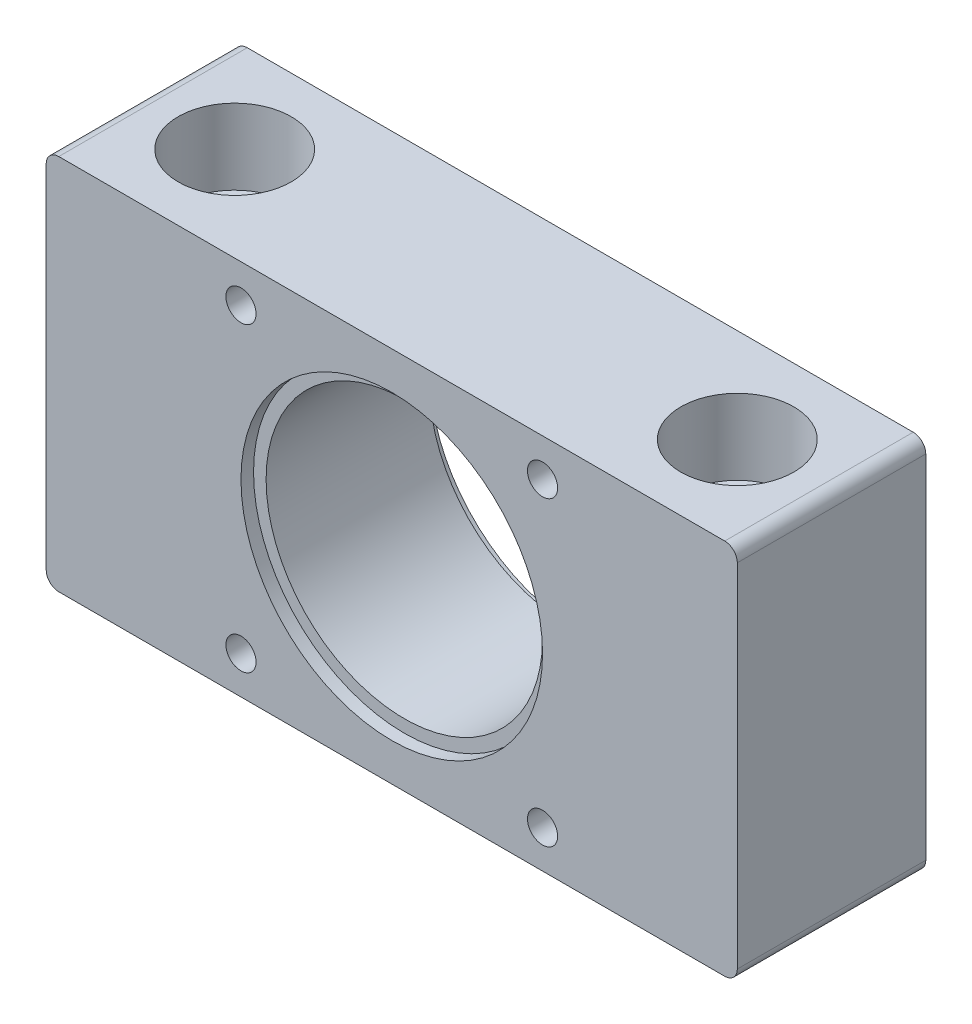
ISO-10303-21;
HEADER;
FILE_DESCRIPTION(('STEP AP214'),'2;1');
FILE_NAME('part.step','',(''),(''),'','','');
FILE_SCHEMA(('AUTOMOTIVE_DESIGN { 1 0 10303 214 1 1 1 1 }'));
ENDSEC;
DATA;
#1=APPLICATION_CONTEXT('core data for automotive mechanical design processes');
#2=APPLICATION_PROTOCOL_DEFINITION('international standard','automotive_design',2000,#1);
#3=PRODUCT_CONTEXT('',#1,'mechanical');
#4=PRODUCT('Part','Part','',(#3));
#5=PRODUCT_RELATED_PRODUCT_CATEGORY('part','',(#4));
#6=PRODUCT_DEFINITION_FORMATION('','',#4);
#7=PRODUCT_DEFINITION_CONTEXT('part definition',#1,'design');
#8=PRODUCT_DEFINITION('design','',#6,#7);
#9=PRODUCT_DEFINITION_SHAPE('','',#8);
#10=(LENGTH_UNIT() NAMED_UNIT(*) SI_UNIT(.MILLI.,.METRE.));
#11=(NAMED_UNIT(*) PLANE_ANGLE_UNIT() SI_UNIT($,.RADIAN.));
#12=(NAMED_UNIT(*) SI_UNIT($,.STERADIAN.) SOLID_ANGLE_UNIT());
#13=UNCERTAINTY_MEASURE_WITH_UNIT(LENGTH_MEASURE(1.E-05),#10,'distance_accuracy_value','');
#14=(GEOMETRIC_REPRESENTATION_CONTEXT(3) GLOBAL_UNCERTAINTY_ASSIGNED_CONTEXT((#13)) GLOBAL_UNIT_ASSIGNED_CONTEXT((#10,
#11,#12)) REPRESENTATION_CONTEXT('',''));
#15=CARTESIAN_POINT('',(0.,0.,0.));
#16=DIRECTION('',(0.,0.,1.));
#17=DIRECTION('',(1.,0.,0.));
#18=AXIS2_PLACEMENT_3D('',#15,#16,#17);
#19=CARTESIAN_POINT('',(20.,-15.,7.49999999999999));
#20=DIRECTION('',(0.,1.,0.));
#21=DIRECTION('',(0.,0.,1.));
#22=AXIS2_PLACEMENT_3D('',#19,#20,#21);
#23=CYLINDRICAL_SURFACE('',#22,2.55);
#24=CARTESIAN_POINT('',(20.,-15.,7.49999999999999));
#25=DIRECTION('',(0.,1.,0.));
#26=DIRECTION('',(0.,0.,-1.));
#27=AXIS2_PLACEMENT_3D('',#24,#25,#26);
#28=CIRCLE('',#27,2.55);
#29=CARTESIAN_POINT('',(20.,-15.,4.94999999999999));
#30=VERTEX_POINT('',#29);
#31=EDGE_CURVE('E149',#30,#30,#28,.T.);
#32=ORIENTED_EDGE('',*,*,#31,.F.);
#33=EDGE_LOOP('',(#32));
#34=FACE_BOUND('',#33,.T.);
#35=CARTESIAN_POINT('',(20.,9.,7.49999999999999));
#36=DIRECTION('',(0.,1.,0.));
#37=DIRECTION('',(0.,0.,1.));
#38=AXIS2_PLACEMENT_3D('',#35,#36,#37);
#39=CIRCLE('',#38,2.55);
#40=CARTESIAN_POINT('',(20.,9.,10.05));
#41=VERTEX_POINT('',#40);
#42=EDGE_CURVE('E51',#41,#41,#39,.F.);
#43=ORIENTED_EDGE('',*,*,#42,.F.);
#44=EDGE_LOOP('',(#43));
#45=FACE_BOUND('',#44,.T.);
#46=ADVANCED_FACE('F47',(#34,#45),#23,.F.);
#47=CARTESIAN_POINT('',(-20.,-15.,7.5));
#48=DIRECTION('',(0.,1.,0.));
#49=DIRECTION('',(0.,0.,1.));
#50=AXIS2_PLACEMENT_3D('',#47,#48,#49);
#51=CYLINDRICAL_SURFACE('',#50,2.55);
#52=CARTESIAN_POINT('',(-20.,-15.,7.5));
#53=DIRECTION('',(0.,1.,0.));
#54=DIRECTION('',(0.,0.,1.));
#55=AXIS2_PLACEMENT_3D('',#52,#53,#54);
#56=CIRCLE('',#55,2.55);
#57=CARTESIAN_POINT('',(-20.,-15.,10.05));
#58=VERTEX_POINT('',#57);
#59=EDGE_CURVE('E143',#58,#58,#56,.T.);
#60=ORIENTED_EDGE('',*,*,#59,.F.);
#61=EDGE_LOOP('',(#60));
#62=FACE_BOUND('',#61,.T.);
#63=CARTESIAN_POINT('',(-20.,9.,7.5));
#64=DIRECTION('',(0.,1.,0.));
#65=DIRECTION('',(0.,0.,1.));
#66=AXIS2_PLACEMENT_3D('',#63,#64,#65);
#67=CIRCLE('',#66,2.55);
#68=CARTESIAN_POINT('',(-20.,9.,10.05));
#69=VERTEX_POINT('',#68);
#70=EDGE_CURVE('E186',#69,#69,#67,.F.);
#71=ORIENTED_EDGE('',*,*,#70,.F.);
#72=EDGE_LOOP('',(#71));
#73=FACE_BOUND('',#72,.T.);
#74=ADVANCED_FACE('F273',(#62,#73),#51,.F.);
#75=CARTESIAN_POINT('',(0.,0.,15.));
#76=DIRECTION('',(0.,0.,-1.));
#77=DIRECTION('',(-1.,0.,0.));
#78=AXIS2_PLACEMENT_3D('',#75,#76,#77);
#79=CYLINDRICAL_SURFACE('',#78,11.);
#80=CARTESIAN_POINT('',(0.,0.,1.));
#81=DIRECTION('',(0.,0.,-1.));
#82=DIRECTION('',(-1.,0.,0.));
#83=AXIS2_PLACEMENT_3D('',#80,#81,#82);
#84=CIRCLE('',#83,11.);
#85=CARTESIAN_POINT('',(-11.,0.,1.));
#86=VERTEX_POINT('',#85);
#87=EDGE_CURVE('E158',#86,#86,#84,.T.);
#88=ORIENTED_EDGE('',*,*,#87,.T.);
#89=EDGE_LOOP('',(#88));
#90=FACE_BOUND('',#89,.T.);
#91=CARTESIAN_POINT('',(0.,0.,14.));
#92=DIRECTION('',(0.,0.,1.));
#93=DIRECTION('',(1.,0.,0.));
#94=AXIS2_PLACEMENT_3D('',#91,#92,#93);
#95=CIRCLE('',#94,11.);
#96=CARTESIAN_POINT('',(11.,0.,14.));
#97=VERTEX_POINT('',#96);
#98=EDGE_CURVE('E162',#97,#97,#95,.T.);
#99=ORIENTED_EDGE('',*,*,#98,.T.);
#100=EDGE_LOOP('',(#99));
#101=FACE_BOUND('',#100,.T.);
#102=ADVANCED_FACE('F279',(#90,#101),#79,.F.);
#103=CARTESIAN_POINT('',(0.,0.,15.));
#104=DIRECTION('',(0.,0.,1.));
#105=DIRECTION('',(1.,0.,0.));
#106=AXIS2_PLACEMENT_3D('',#103,#104,#105);
#107=PLANE('',#106);
#108=CARTESIAN_POINT('',(12.,12.,15.));
#109=DIRECTION('',(0.,0.,1.));
#110=DIRECTION('',(1.,0.,0.));
#111=AXIS2_PLACEMENT_3D('',#108,#109,#110);
#112=CIRCLE('',#111,1.2);
#113=CARTESIAN_POINT('',(13.2,12.,15.));
#114=VERTEX_POINT('',#113);
#115=EDGE_CURVE('E217',#114,#114,#112,.T.);
#116=ORIENTED_EDGE('',*,*,#115,.F.);
#117=EDGE_LOOP('',(#116));
#118=FACE_BOUND('',#117,.T.);
#119=CARTESIAN_POINT('',(-12.,-12.,15.));
#120=DIRECTION('',(0.,0.,1.));
#121=DIRECTION('',(1.,0.,0.));
#122=AXIS2_PLACEMENT_3D('',#119,#120,#121);
#123=CIRCLE('',#122,1.2);
#124=CARTESIAN_POINT('',(-10.8,-12.,15.));
#125=VERTEX_POINT('',#124);
#126=EDGE_CURVE('E210',#125,#125,#123,.T.);
#127=ORIENTED_EDGE('',*,*,#126,.F.);
#128=EDGE_LOOP('',(#127));
#129=FACE_BOUND('',#128,.T.);
#130=CARTESIAN_POINT('',(12.,-12.,15.));
#131=DIRECTION('',(0.,0.,1.));
#132=DIRECTION('',(-1.,0.,0.));
#133=AXIS2_PLACEMENT_3D('',#130,#131,#132);
#134=CIRCLE('',#133,1.2);
#135=CARTESIAN_POINT('',(10.8,-12.,15.));
#136=VERTEX_POINT('',#135);
#137=EDGE_CURVE('E192',#136,#136,#134,.T.);
#138=ORIENTED_EDGE('',*,*,#137,.F.);
#139=EDGE_LOOP('',(#138));
#140=FACE_BOUND('',#139,.T.);
#141=CARTESIAN_POINT('',(-12.,12.,15.));
#142=DIRECTION('',(0.,0.,1.));
#143=DIRECTION('',(-1.,0.,0.));
#144=AXIS2_PLACEMENT_3D('',#141,#142,#143);
#145=CIRCLE('',#144,1.2);
#146=CARTESIAN_POINT('',(-13.2,12.,15.));
#147=VERTEX_POINT('',#146);
#148=EDGE_CURVE('E216',#147,#147,#145,.T.);
#149=ORIENTED_EDGE('',*,*,#148,.F.);
#150=EDGE_LOOP('',(#149));
#151=FACE_BOUND('',#150,.T.);
#152=CARTESIAN_POINT('',(0.,0.,15.));
#153=DIRECTION('',(0.,0.,1.));
#154=DIRECTION('',(1.,0.,0.));
#155=AXIS2_PLACEMENT_3D('',#152,#153,#154);
#156=CIRCLE('',#155,12.);
#157=CARTESIAN_POINT('',(12.,0.,15.));
#158=VERTEX_POINT('',#157);
#159=EDGE_CURVE('E228',#158,#158,#156,.T.);
#160=ORIENTED_EDGE('',*,*,#159,.F.);
#161=EDGE_LOOP('',(#160));
#162=FACE_BOUND('',#161,.T.);
#163=DIRECTION('',(-1.,0.,0.));
#164=VECTOR('',#163,1.);
#165=CARTESIAN_POINT('',(-27.5,15.,15.));
#166=LINE('',#165,#164);
#167=CARTESIAN_POINT('',(26.5,15.,15.));
#168=VERTEX_POINT('',#167);
#169=CARTESIAN_POINT('',(-26.5,15.,15.));
#170=VERTEX_POINT('',#169);
#171=EDGE_CURVE('E152',#168,#170,#166,.T.);
#172=ORIENTED_EDGE('',*,*,#171,.T.);
#173=CARTESIAN_POINT('',(-26.5,14.,15.));
#174=DIRECTION('',(0.,0.,1.));
#175=DIRECTION('',(1.,0.,0.));
#176=AXIS2_PLACEMENT_3D('',#173,#174,#175);
#177=CIRCLE('',#176,1.);
#178=CARTESIAN_POINT('',(-27.5,14.,15.));
#179=VERTEX_POINT('',#178);
#180=EDGE_CURVE('E179',#170,#179,#177,.T.);
#181=ORIENTED_EDGE('',*,*,#180,.T.);
#182=DIRECTION('',(0.,-1.,0.));
#183=VECTOR('',#182,1.);
#184=CARTESIAN_POINT('',(-27.5,15.,15.));
#185=LINE('',#184,#183);
#186=CARTESIAN_POINT('',(-27.5,-14.,15.));
#187=VERTEX_POINT('',#186);
#188=EDGE_CURVE('E135',#179,#187,#185,.T.);
#189=ORIENTED_EDGE('',*,*,#188,.T.);
#190=CARTESIAN_POINT('',(-26.5,-14.,15.));
#191=DIRECTION('',(0.,0.,1.));
#192=DIRECTION('',(1.,0.,0.));
#193=AXIS2_PLACEMENT_3D('',#190,#191,#192);
#194=CIRCLE('',#193,1.);
#195=CARTESIAN_POINT('',(-26.5,-15.,15.));
#196=VERTEX_POINT('',#195);
#197=EDGE_CURVE('E176',#187,#196,#194,.T.);
#198=ORIENTED_EDGE('',*,*,#197,.T.);
#199=DIRECTION('',(1.,0.,0.));
#200=VECTOR('',#199,1.);
#201=CARTESIAN_POINT('',(-27.5,-15.,15.));
#202=LINE('',#201,#200);
#203=CARTESIAN_POINT('',(26.5,-15.,15.));
#204=VERTEX_POINT('',#203);
#205=EDGE_CURVE('E242',#196,#204,#202,.T.);
#206=ORIENTED_EDGE('',*,*,#205,.T.);
#207=CARTESIAN_POINT('',(26.5,-14.,15.));
#208=DIRECTION('',(0.,0.,1.));
#209=DIRECTION('',(1.,0.,0.));
#210=AXIS2_PLACEMENT_3D('',#207,#208,#209);
#211=CIRCLE('',#210,1.);
#212=CARTESIAN_POINT('',(27.5,-14.,15.));
#213=VERTEX_POINT('',#212);
#214=EDGE_CURVE('E71',#204,#213,#211,.T.);
#215=ORIENTED_EDGE('',*,*,#214,.T.);
#216=DIRECTION('',(0.,1.,0.));
#217=VECTOR('',#216,1.);
#218=CARTESIAN_POINT('',(27.5,15.,15.));
#219=LINE('',#218,#217);
#220=CARTESIAN_POINT('',(27.5,14.,15.));
#221=VERTEX_POINT('',#220);
#222=EDGE_CURVE('E243',#213,#221,#219,.T.);
#223=ORIENTED_EDGE('',*,*,#222,.T.);
#224=CARTESIAN_POINT('',(26.5,14.,15.));
#225=DIRECTION('',(0.,0.,1.));
#226=DIRECTION('',(1.,0.,0.));
#227=AXIS2_PLACEMENT_3D('',#224,#225,#226);
#228=CIRCLE('',#227,1.);
#229=EDGE_CURVE('E174',#221,#168,#228,.T.);
#230=ORIENTED_EDGE('',*,*,#229,.T.);
#231=EDGE_LOOP('',(#172,#181,#189,#198,#206,#215,#223,#230));
#232=FACE_BOUND('',#231,.T.);
#233=ADVANCED_FACE('F247',(#118,#129,#140,#151,#162,#232),#107,.T.);
#234=CARTESIAN_POINT('',(0.,0.,0.));
#235=DIRECTION('',(0.,0.,1.));
#236=DIRECTION('',(1.,0.,0.));
#237=AXIS2_PLACEMENT_3D('',#234,#235,#236);
#238=PLANE('',#237);
#239=CARTESIAN_POINT('',(12.,12.,0.));
#240=DIRECTION('',(0.,0.,1.));
#241=DIRECTION('',(1.,0.,0.));
#242=AXIS2_PLACEMENT_3D('',#239,#240,#241);
#243=CIRCLE('',#242,1.2);
#244=CARTESIAN_POINT('',(13.2,12.,0.));
#245=VERTEX_POINT('',#244);
#246=EDGE_CURVE('E213',#245,#245,#243,.T.);
#247=ORIENTED_EDGE('',*,*,#246,.T.);
#248=EDGE_LOOP('',(#247));
#249=FACE_BOUND('',#248,.T.);
#250=CARTESIAN_POINT('',(-12.,-12.,0.));
#251=DIRECTION('',(0.,0.,1.));
#252=DIRECTION('',(1.,0.,0.));
#253=AXIS2_PLACEMENT_3D('',#250,#251,#252);
#254=CIRCLE('',#253,1.2);
#255=CARTESIAN_POINT('',(-10.8,-12.,0.));
#256=VERTEX_POINT('',#255);
#257=EDGE_CURVE('E220',#256,#256,#254,.T.);
#258=ORIENTED_EDGE('',*,*,#257,.T.);
#259=EDGE_LOOP('',(#258));
#260=FACE_BOUND('',#259,.T.);
#261=CARTESIAN_POINT('',(12.,-12.,0.));
#262=DIRECTION('',(0.,0.,1.));
#263=DIRECTION('',(-1.,0.,0.));
#264=AXIS2_PLACEMENT_3D('',#261,#262,#263);
#265=CIRCLE('',#264,1.2);
#266=CARTESIAN_POINT('',(10.8,-12.,0.));
#267=VERTEX_POINT('',#266);
#268=EDGE_CURVE('E207',#267,#267,#265,.T.);
#269=ORIENTED_EDGE('',*,*,#268,.T.);
#270=EDGE_LOOP('',(#269));
#271=FACE_BOUND('',#270,.T.);
#272=CARTESIAN_POINT('',(-12.,12.,0.));
#273=DIRECTION('',(0.,0.,1.));
#274=DIRECTION('',(-1.,0.,0.));
#275=AXIS2_PLACEMENT_3D('',#272,#273,#274);
#276=CIRCLE('',#275,1.2);
#277=CARTESIAN_POINT('',(-13.2,12.,0.));
#278=VERTEX_POINT('',#277);
#279=EDGE_CURVE('E225',#278,#278,#276,.T.);
#280=ORIENTED_EDGE('',*,*,#279,.T.);
#281=EDGE_LOOP('',(#280));
#282=FACE_BOUND('',#281,.T.);
#283=CARTESIAN_POINT('',(0.,0.,0.));
#284=DIRECTION('',(0.,0.,-1.));
#285=DIRECTION('',(-1.,0.,0.));
#286=AXIS2_PLACEMENT_3D('',#283,#284,#285);
#287=CIRCLE('',#286,12.);
#288=CARTESIAN_POINT('',(-12.,0.,0.));
#289=VERTEX_POINT('',#288);
#290=EDGE_CURVE('E165',#289,#289,#287,.T.);
#291=ORIENTED_EDGE('',*,*,#290,.F.);
#292=EDGE_LOOP('',(#291));
#293=FACE_BOUND('',#292,.T.);
#294=DIRECTION('',(0.,-1.,0.));
#295=VECTOR('',#294,1.);
#296=CARTESIAN_POINT('',(-27.5,15.,0.));
#297=LINE('',#296,#295);
#298=CARTESIAN_POINT('',(-27.5,14.,0.));
#299=VERTEX_POINT('',#298);
#300=CARTESIAN_POINT('',(-27.5,-14.,0.));
#301=VERTEX_POINT('',#300);
#302=EDGE_CURVE('E132',#299,#301,#297,.T.);
#303=ORIENTED_EDGE('',*,*,#302,.F.);
#304=CARTESIAN_POINT('',(-26.5,14.,0.));
#305=DIRECTION('',(0.,0.,1.));
#306=DIRECTION('',(1.,0.,0.));
#307=AXIS2_PLACEMENT_3D('',#304,#305,#306);
#308=CIRCLE('',#307,1.);
#309=CARTESIAN_POINT('',(-26.5,15.,0.));
#310=VERTEX_POINT('',#309);
#311=EDGE_CURVE('E115',#299,#310,#308,.F.);
#312=ORIENTED_EDGE('',*,*,#311,.T.);
#313=DIRECTION('',(-1.,0.,0.));
#314=VECTOR('',#313,1.);
#315=CARTESIAN_POINT('',(-27.5,15.,0.));
#316=LINE('',#315,#314);
#317=CARTESIAN_POINT('',(26.5,15.,0.));
#318=VERTEX_POINT('',#317);
#319=EDGE_CURVE('E156',#318,#310,#316,.T.);
#320=ORIENTED_EDGE('',*,*,#319,.F.);
#321=CARTESIAN_POINT('',(26.5,14.,0.));
#322=DIRECTION('',(0.,0.,1.));
#323=DIRECTION('',(1.,0.,0.));
#324=AXIS2_PLACEMENT_3D('',#321,#322,#323);
#325=CIRCLE('',#324,1.);
#326=CARTESIAN_POINT('',(27.5,14.,0.));
#327=VERTEX_POINT('',#326);
#328=EDGE_CURVE('E136',#318,#327,#325,.F.);
#329=ORIENTED_EDGE('',*,*,#328,.T.);
#330=DIRECTION('',(0.,1.,0.));
#331=VECTOR('',#330,1.);
#332=CARTESIAN_POINT('',(27.5,15.,0.));
#333=LINE('',#332,#331);
#334=CARTESIAN_POINT('',(27.5,-14.,0.));
#335=VERTEX_POINT('',#334);
#336=EDGE_CURVE('E146',#335,#327,#333,.T.);
#337=ORIENTED_EDGE('',*,*,#336,.F.);
#338=CARTESIAN_POINT('',(26.5,-14.,0.));
#339=DIRECTION('',(0.,0.,1.));
#340=DIRECTION('',(1.,0.,0.));
#341=AXIS2_PLACEMENT_3D('',#338,#339,#340);
#342=CIRCLE('',#341,1.);
#343=CARTESIAN_POINT('',(26.5,-15.,0.));
#344=VERTEX_POINT('',#343);
#345=EDGE_CURVE('E126',#335,#344,#342,.F.);
#346=ORIENTED_EDGE('',*,*,#345,.T.);
#347=DIRECTION('',(1.,0.,0.));
#348=VECTOR('',#347,1.);
#349=CARTESIAN_POINT('',(-27.5,-15.,0.));
#350=LINE('',#349,#348);
#351=CARTESIAN_POINT('',(-26.5,-15.,0.));
#352=VERTEX_POINT('',#351);
#353=EDGE_CURVE('E142',#352,#344,#350,.T.);
#354=ORIENTED_EDGE('',*,*,#353,.F.);
#355=CARTESIAN_POINT('',(-26.5,-14.,0.));
#356=DIRECTION('',(0.,0.,1.));
#357=DIRECTION('',(1.,0.,0.));
#358=AXIS2_PLACEMENT_3D('',#355,#356,#357);
#359=CIRCLE('',#358,1.);
#360=EDGE_CURVE('E141',#352,#301,#359,.F.);
#361=ORIENTED_EDGE('',*,*,#360,.T.);
#362=EDGE_LOOP('',(#303,#312,#320,#329,#337,#346,#354,#361));
#363=FACE_BOUND('',#362,.T.);
#364=ADVANCED_FACE('F139',(#249,#260,#271,#282,#293,#363),#238,.F.);
#365=CARTESIAN_POINT('',(-27.5,15.,15.));
#366=DIRECTION('',(1.,0.,0.));
#367=DIRECTION('',(0.,0.,-1.));
#368=AXIS2_PLACEMENT_3D('',#365,#366,#367);
#369=PLANE('',#368);
#370=ORIENTED_EDGE('',*,*,#188,.F.);
#371=DIRECTION('',(0.,0.,-1.));
#372=VECTOR('',#371,1.);
#373=CARTESIAN_POINT('',(-27.5,14.,15.));
#374=LINE('',#373,#372);
#375=EDGE_CURVE('E119',#179,#299,#374,.T.);
#376=ORIENTED_EDGE('',*,*,#375,.T.);
#377=ORIENTED_EDGE('',*,*,#302,.T.);
#378=DIRECTION('',(0.,0.,-1.));
#379=VECTOR('',#378,1.);
#380=CARTESIAN_POINT('',(-27.5,-14.,15.));
#381=LINE('',#380,#379);
#382=EDGE_CURVE('E137',#301,#187,#381,.F.);
#383=ORIENTED_EDGE('',*,*,#382,.T.);
#384=EDGE_LOOP('',(#370,#376,#377,#383));
#385=FACE_BOUND('',#384,.T.);
#386=ADVANCED_FACE('F131',(#385),#369,.F.);
#387=CARTESIAN_POINT('',(-27.5,-15.,15.));
#388=DIRECTION('',(0.,1.,0.));
#389=DIRECTION('',(0.,0.,1.));
#390=AXIS2_PLACEMENT_3D('',#387,#388,#389);
#391=PLANE('',#390);
#392=ORIENTED_EDGE('',*,*,#59,.T.);
#393=EDGE_LOOP('',(#392));
#394=FACE_BOUND('',#393,.T.);
#395=ORIENTED_EDGE('',*,*,#31,.T.);
#396=EDGE_LOOP('',(#395));
#397=FACE_BOUND('',#396,.T.);
#398=ORIENTED_EDGE('',*,*,#353,.T.);
#399=DIRECTION('',(0.,0.,-1.));
#400=VECTOR('',#399,1.);
#401=CARTESIAN_POINT('',(26.5,-15.,15.));
#402=LINE('',#401,#400);
#403=EDGE_CURVE('E11',#344,#204,#402,.F.);
#404=ORIENTED_EDGE('',*,*,#403,.T.);
#405=ORIENTED_EDGE('',*,*,#205,.F.);
#406=DIRECTION('',(0.,0.,-1.));
#407=VECTOR('',#406,1.);
#408=CARTESIAN_POINT('',(-26.5,-15.,15.));
#409=LINE('',#408,#407);
#410=EDGE_CURVE('E56',#196,#352,#409,.T.);
#411=ORIENTED_EDGE('',*,*,#410,.T.);
#412=EDGE_LOOP('',(#398,#404,#405,#411));
#413=FACE_BOUND('',#412,.T.);
#414=ADVANCED_FACE('F259',(#394,#397,#413),#391,.F.);
#415=CARTESIAN_POINT('',(27.5,15.,15.));
#416=DIRECTION('',(-1.,0.,0.));
#417=DIRECTION('',(0.,0.,1.));
#418=AXIS2_PLACEMENT_3D('',#415,#416,#417);
#419=PLANE('',#418);
#420=ORIENTED_EDGE('',*,*,#222,.F.);
#421=DIRECTION('',(0.,0.,-1.));
#422=VECTOR('',#421,1.);
#423=CARTESIAN_POINT('',(27.5,-14.,15.));
#424=LINE('',#423,#422);
#425=EDGE_CURVE('E182',#213,#335,#424,.T.);
#426=ORIENTED_EDGE('',*,*,#425,.T.);
#427=ORIENTED_EDGE('',*,*,#336,.T.);
#428=DIRECTION('',(0.,0.,-1.));
#429=VECTOR('',#428,1.);
#430=CARTESIAN_POINT('',(27.5,14.,15.));
#431=LINE('',#430,#429);
#432=EDGE_CURVE('E64',#327,#221,#431,.F.);
#433=ORIENTED_EDGE('',*,*,#432,.T.);
#434=EDGE_LOOP('',(#420,#426,#427,#433));
#435=FACE_BOUND('',#434,.T.);
#436=ADVANCED_FACE('F253',(#435),#419,.F.);
#437=CARTESIAN_POINT('',(-27.5,15.,15.));
#438=DIRECTION('',(0.,-1.,0.));
#439=DIRECTION('',(0.,0.,-1.));
#440=AXIS2_PLACEMENT_3D('',#437,#438,#439);
#441=PLANE('',#440);
#442=CARTESIAN_POINT('',(-20.,15.,7.5));
#443=DIRECTION('',(0.,1.,0.));
#444=DIRECTION('',(0.,0.,1.));
#445=AXIS2_PLACEMENT_3D('',#442,#443,#444);
#446=CIRCLE('',#445,4.5);
#447=CARTESIAN_POINT('',(-20.,15.,12.));
#448=VERTEX_POINT('',#447);
#449=EDGE_CURVE('E194',#448,#448,#446,.T.);
#450=ORIENTED_EDGE('',*,*,#449,.F.);
#451=EDGE_LOOP('',(#450));
#452=FACE_BOUND('',#451,.T.);
#453=CARTESIAN_POINT('',(20.,15.,7.49999999999999));
#454=DIRECTION('',(0.,1.,0.));
#455=DIRECTION('',(0.,0.,1.));
#456=AXIS2_PLACEMENT_3D('',#453,#454,#455);
#457=CIRCLE('',#456,4.5);
#458=CARTESIAN_POINT('',(20.,15.,12.));
#459=VERTEX_POINT('',#458);
#460=EDGE_CURVE('E204',#459,#459,#457,.T.);
#461=ORIENTED_EDGE('',*,*,#460,.F.);
#462=EDGE_LOOP('',(#461));
#463=FACE_BOUND('',#462,.T.);
#464=ORIENTED_EDGE('',*,*,#319,.T.);
#465=DIRECTION('',(0.,0.,-1.));
#466=VECTOR('',#465,1.);
#467=CARTESIAN_POINT('',(-26.5,15.,15.));
#468=LINE('',#467,#466);
#469=EDGE_CURVE('E120',#310,#170,#468,.F.);
#470=ORIENTED_EDGE('',*,*,#469,.T.);
#471=ORIENTED_EDGE('',*,*,#171,.F.);
#472=DIRECTION('',(0.,0.,-1.));
#473=VECTOR('',#472,1.);
#474=CARTESIAN_POINT('',(26.5,15.,15.));
#475=LINE('',#474,#473);
#476=EDGE_CURVE('E125',#168,#318,#475,.T.);
#477=ORIENTED_EDGE('',*,*,#476,.T.);
#478=EDGE_LOOP('',(#464,#470,#471,#477));
#479=FACE_BOUND('',#478,.T.);
#480=ADVANCED_FACE('F250',(#452,#463,#479),#441,.F.);
#481=CARTESIAN_POINT('',(0.,0.,1.));
#482=DIRECTION('',(0.,0.,-1.));
#483=DIRECTION('',(-1.,0.,0.));
#484=AXIS2_PLACEMENT_3D('',#481,#482,#483);
#485=CYLINDRICAL_SURFACE('',#484,12.);
#486=CARTESIAN_POINT('',(0.,0.,1.));
#487=DIRECTION('',(0.,0.,-1.));
#488=DIRECTION('',(-1.,0.,0.));
#489=AXIS2_PLACEMENT_3D('',#486,#487,#488);
#490=CIRCLE('',#489,12.);
#491=CARTESIAN_POINT('',(-12.,0.,1.));
#492=VERTEX_POINT('',#491);
#493=EDGE_CURVE('E161',#492,#492,#490,.T.);
#494=ORIENTED_EDGE('',*,*,#493,.F.);
#495=EDGE_LOOP('',(#494));
#496=FACE_BOUND('',#495,.T.);
#497=ORIENTED_EDGE('',*,*,#290,.T.);
#498=EDGE_LOOP('',(#497));
#499=FACE_BOUND('',#498,.T.);
#500=ADVANCED_FACE('F297',(#496,#499),#485,.F.);
#501=CARTESIAN_POINT('',(0.,0.,1.));
#502=DIRECTION('',(0.,0.,-1.));
#503=DIRECTION('',(-1.,0.,0.));
#504=AXIS2_PLACEMENT_3D('',#501,#502,#503);
#505=PLANE('',#504);
#506=ORIENTED_EDGE('',*,*,#87,.F.);
#507=EDGE_LOOP('',(#506));
#508=FACE_BOUND('',#507,.T.);
#509=ORIENTED_EDGE('',*,*,#493,.T.);
#510=EDGE_LOOP('',(#509));
#511=FACE_BOUND('',#510,.T.);
#512=ADVANCED_FACE('F336',(#508,#511),#505,.T.);
#513=CARTESIAN_POINT('',(0.,0.,14.));
#514=DIRECTION('',(0.,0.,1.));
#515=DIRECTION('',(1.,0.,0.));
#516=AXIS2_PLACEMENT_3D('',#513,#514,#515);
#517=CYLINDRICAL_SURFACE('',#516,12.);
#518=CARTESIAN_POINT('',(0.,0.,14.));
#519=DIRECTION('',(0.,0.,1.));
#520=DIRECTION('',(1.,0.,0.));
#521=AXIS2_PLACEMENT_3D('',#518,#519,#520);
#522=CIRCLE('',#521,12.);
#523=CARTESIAN_POINT('',(12.,0.,14.));
#524=VERTEX_POINT('',#523);
#525=EDGE_CURVE('E166',#524,#524,#522,.T.);
#526=ORIENTED_EDGE('',*,*,#525,.F.);
#527=EDGE_LOOP('',(#526));
#528=FACE_BOUND('',#527,.T.);
#529=ORIENTED_EDGE('',*,*,#159,.T.);
#530=EDGE_LOOP('',(#529));
#531=FACE_BOUND('',#530,.T.);
#532=ADVANCED_FACE('F332',(#528,#531),#517,.F.);
#533=CARTESIAN_POINT('',(0.,0.,14.));
#534=DIRECTION('',(0.,0.,1.));
#535=DIRECTION('',(1.,0.,0.));
#536=AXIS2_PLACEMENT_3D('',#533,#534,#535);
#537=PLANE('',#536);
#538=ORIENTED_EDGE('',*,*,#98,.F.);
#539=EDGE_LOOP('',(#538));
#540=FACE_BOUND('',#539,.T.);
#541=ORIENTED_EDGE('',*,*,#525,.T.);
#542=EDGE_LOOP('',(#541));
#543=FACE_BOUND('',#542,.T.);
#544=ADVANCED_FACE('F328',(#540,#543),#537,.T.);
#545=CARTESIAN_POINT('',(-12.,12.,0.));
#546=DIRECTION('',(0.,0.,1.));
#547=DIRECTION('',(1.,0.,0.));
#548=AXIS2_PLACEMENT_3D('',#545,#546,#547);
#549=CYLINDRICAL_SURFACE('',#548,1.2);
#550=ORIENTED_EDGE('',*,*,#279,.F.);
#551=EDGE_LOOP('',(#550));
#552=FACE_BOUND('',#551,.T.);
#553=ORIENTED_EDGE('',*,*,#148,.T.);
#554=EDGE_LOOP('',(#553));
#555=FACE_BOUND('',#554,.T.);
#556=ADVANCED_FACE('F325',(#552,#555),#549,.F.);
#557=CARTESIAN_POINT('',(12.,-12.,0.));
#558=DIRECTION('',(0.,0.,1.));
#559=DIRECTION('',(1.,0.,0.));
#560=AXIS2_PLACEMENT_3D('',#557,#558,#559);
#561=CYLINDRICAL_SURFACE('',#560,1.2);
#562=ORIENTED_EDGE('',*,*,#268,.F.);
#563=EDGE_LOOP('',(#562));
#564=FACE_BOUND('',#563,.T.);
#565=ORIENTED_EDGE('',*,*,#137,.T.);
#566=EDGE_LOOP('',(#565));
#567=FACE_BOUND('',#566,.T.);
#568=ADVANCED_FACE('F317',(#564,#567),#561,.F.);
#569=CARTESIAN_POINT('',(-12.,-12.,0.));
#570=DIRECTION('',(0.,0.,1.));
#571=DIRECTION('',(1.,0.,0.));
#572=AXIS2_PLACEMENT_3D('',#569,#570,#571);
#573=CYLINDRICAL_SURFACE('',#572,1.2);
#574=ORIENTED_EDGE('',*,*,#257,.F.);
#575=EDGE_LOOP('',(#574));
#576=FACE_BOUND('',#575,.T.);
#577=ORIENTED_EDGE('',*,*,#126,.T.);
#578=EDGE_LOOP('',(#577));
#579=FACE_BOUND('',#578,.T.);
#580=ADVANCED_FACE('F311',(#576,#579),#573,.F.);
#581=CARTESIAN_POINT('',(12.,12.,0.));
#582=DIRECTION('',(0.,0.,1.));
#583=DIRECTION('',(1.,0.,0.));
#584=AXIS2_PLACEMENT_3D('',#581,#582,#583);
#585=CYLINDRICAL_SURFACE('',#584,1.2);
#586=ORIENTED_EDGE('',*,*,#246,.F.);
#587=EDGE_LOOP('',(#586));
#588=FACE_BOUND('',#587,.T.);
#589=ORIENTED_EDGE('',*,*,#115,.T.);
#590=EDGE_LOOP('',(#589));
#591=FACE_BOUND('',#590,.T.);
#592=ADVANCED_FACE('F307',(#588,#591),#585,.F.);
#593=CARTESIAN_POINT('',(-26.5,14.,15.));
#594=DIRECTION('',(0.,0.,-1.));
#595=DIRECTION('',(-1.,0.,0.));
#596=AXIS2_PLACEMENT_3D('',#593,#594,#595);
#597=CYLINDRICAL_SURFACE('',#596,1.);
#598=ORIENTED_EDGE('',*,*,#180,.F.);
#599=ORIENTED_EDGE('',*,*,#469,.F.);
#600=ORIENTED_EDGE('',*,*,#311,.F.);
#601=ORIENTED_EDGE('',*,*,#375,.F.);
#602=EDGE_LOOP('',(#598,#599,#600,#601));
#603=FACE_BOUND('',#602,.T.);
#604=ADVANCED_FACE('F118',(#603),#597,.T.);
#605=CARTESIAN_POINT('',(26.5,-14.,15.));
#606=DIRECTION('',(0.,0.,-1.));
#607=DIRECTION('',(-1.,0.,0.));
#608=AXIS2_PLACEMENT_3D('',#605,#606,#607);
#609=CYLINDRICAL_SURFACE('',#608,1.);
#610=ORIENTED_EDGE('',*,*,#214,.F.);
#611=ORIENTED_EDGE('',*,*,#403,.F.);
#612=ORIENTED_EDGE('',*,*,#345,.F.);
#613=ORIENTED_EDGE('',*,*,#425,.F.);
#614=EDGE_LOOP('',(#610,#611,#612,#613));
#615=FACE_BOUND('',#614,.T.);
#616=ADVANCED_FACE('F256',(#615),#609,.T.);
#617=CARTESIAN_POINT('',(-26.5,-14.,15.));
#618=DIRECTION('',(0.,0.,-1.));
#619=DIRECTION('',(-1.,0.,0.));
#620=AXIS2_PLACEMENT_3D('',#617,#618,#619);
#621=CYLINDRICAL_SURFACE('',#620,1.);
#622=ORIENTED_EDGE('',*,*,#197,.F.);
#623=ORIENTED_EDGE('',*,*,#382,.F.);
#624=ORIENTED_EDGE('',*,*,#360,.F.);
#625=ORIENTED_EDGE('',*,*,#410,.F.);
#626=EDGE_LOOP('',(#622,#623,#624,#625));
#627=FACE_BOUND('',#626,.T.);
#628=ADVANCED_FACE('F264',(#627),#621,.T.);
#629=CARTESIAN_POINT('',(26.5,14.,15.));
#630=DIRECTION('',(0.,0.,-1.));
#631=DIRECTION('',(-1.,0.,0.));
#632=AXIS2_PLACEMENT_3D('',#629,#630,#631);
#633=CYLINDRICAL_SURFACE('',#632,1.);
#634=ORIENTED_EDGE('',*,*,#229,.F.);
#635=ORIENTED_EDGE('',*,*,#432,.F.);
#636=ORIENTED_EDGE('',*,*,#328,.F.);
#637=ORIENTED_EDGE('',*,*,#476,.F.);
#638=EDGE_LOOP('',(#634,#635,#636,#637));
#639=FACE_BOUND('',#638,.T.);
#640=ADVANCED_FACE('F49',(#639),#633,.T.);
#641=CARTESIAN_POINT('',(-20.,9.,7.5));
#642=DIRECTION('',(0.,1.,0.));
#643=DIRECTION('',(0.,0.,1.));
#644=AXIS2_PLACEMENT_3D('',#641,#642,#643);
#645=PLANE('',#644);
#646=CARTESIAN_POINT('',(-20.,9.,7.5));
#647=DIRECTION('',(0.,1.,0.));
#648=DIRECTION('',(0.,0.,1.));
#649=AXIS2_PLACEMENT_3D('',#646,#647,#648);
#650=CIRCLE('',#649,4.5);
#651=CARTESIAN_POINT('',(-20.,9.,12.));
#652=VERTEX_POINT('',#651);
#653=EDGE_CURVE('E188',#652,#652,#650,.T.);
#654=ORIENTED_EDGE('',*,*,#653,.T.);
#655=EDGE_LOOP('',(#654));
#656=FACE_BOUND('',#655,.T.);
#657=ORIENTED_EDGE('',*,*,#70,.T.);
#658=EDGE_LOOP('',(#657));
#659=FACE_BOUND('',#658,.T.);
#660=ADVANCED_FACE('F270',(#656,#659),#645,.T.);
#661=CARTESIAN_POINT('',(-20.,9.,7.5));
#662=DIRECTION('',(0.,1.,0.));
#663=DIRECTION('',(0.,0.,1.));
#664=AXIS2_PLACEMENT_3D('',#661,#662,#663);
#665=CYLINDRICAL_SURFACE('',#664,4.5);
#666=ORIENTED_EDGE('',*,*,#653,.F.);
#667=EDGE_LOOP('',(#666));
#668=FACE_BOUND('',#667,.T.);
#669=ORIENTED_EDGE('',*,*,#449,.T.);
#670=EDGE_LOOP('',(#669));
#671=FACE_BOUND('',#670,.T.);
#672=ADVANCED_FACE('F430',(#668,#671),#665,.F.);
#673=CARTESIAN_POINT('',(20.,9.,7.49999999999999));
#674=DIRECTION('',(0.,1.,0.));
#675=DIRECTION('',(0.,0.,1.));
#676=AXIS2_PLACEMENT_3D('',#673,#674,#675);
#677=PLANE('',#676);
#678=CARTESIAN_POINT('',(20.,9.,7.49999999999999));
#679=DIRECTION('',(0.,1.,0.));
#680=DIRECTION('',(0.,0.,1.));
#681=AXIS2_PLACEMENT_3D('',#678,#679,#680);
#682=CIRCLE('',#681,4.5);
#683=CARTESIAN_POINT('',(20.,9.,12.));
#684=VERTEX_POINT('',#683);
#685=EDGE_CURVE('E199',#684,#684,#682,.T.);
#686=ORIENTED_EDGE('',*,*,#685,.T.);
#687=EDGE_LOOP('',(#686));
#688=FACE_BOUND('',#687,.T.);
#689=ORIENTED_EDGE('',*,*,#42,.T.);
#690=EDGE_LOOP('',(#689));
#691=FACE_BOUND('',#690,.T.);
#692=ADVANCED_FACE('F437',(#688,#691),#677,.T.);
#693=CARTESIAN_POINT('',(20.,9.,7.49999999999999));
#694=DIRECTION('',(0.,1.,0.));
#695=DIRECTION('',(0.,0.,1.));
#696=AXIS2_PLACEMENT_3D('',#693,#694,#695);
#697=CYLINDRICAL_SURFACE('',#696,4.5);
#698=ORIENTED_EDGE('',*,*,#685,.F.);
#699=EDGE_LOOP('',(#698));
#700=FACE_BOUND('',#699,.T.);
#701=ORIENTED_EDGE('',*,*,#460,.T.);
#702=EDGE_LOOP('',(#701));
#703=FACE_BOUND('',#702,.T.);
#704=ADVANCED_FACE('F445',(#700,#703),#697,.F.);
#705=CLOSED_SHELL('',(#46,#74,#102,#233,#364,#386,#414,#436,#480,#500,#512,#532,#544,#556,#568,
#580,#592,#604,#616,#628,#640,#660,#672,#692,#704));
#706=MANIFOLD_SOLID_BREP('B2',#705);
#707=ADVANCED_BREP_SHAPE_REPRESENTATION('',(#18,#706),#14);
#708=SHAPE_DEFINITION_REPRESENTATION(#9,#707);
ENDSEC;
END-ISO-10303-21;
